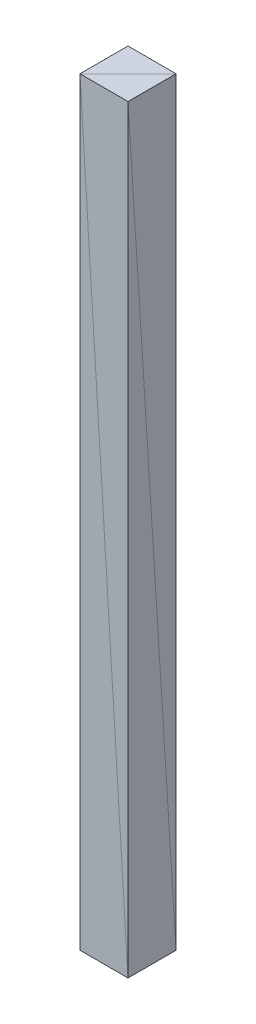
ISO-10303-21;
HEADER;
FILE_DESCRIPTION(('STEP AP214'),'2;1');
FILE_NAME('part.step','',(''),(''),'','','');
FILE_SCHEMA(('AUTOMOTIVE_DESIGN { 1 0 10303 214 1 1 1 1 }'));
ENDSEC;
DATA;
#1=APPLICATION_CONTEXT('core data for automotive mechanical design processes');
#2=APPLICATION_PROTOCOL_DEFINITION('international standard','automotive_design',2000,#1);
#3=PRODUCT_CONTEXT('',#1,'mechanical');
#4=PRODUCT('Part','Part','',(#3));
#5=PRODUCT_RELATED_PRODUCT_CATEGORY('part','',(#4));
#6=PRODUCT_DEFINITION_FORMATION('','',#4);
#7=PRODUCT_DEFINITION_CONTEXT('part definition',#1,'design');
#8=PRODUCT_DEFINITION('design','',#6,#7);
#9=PRODUCT_DEFINITION_SHAPE('','',#8);
#10=(LENGTH_UNIT() NAMED_UNIT(*) SI_UNIT(.MILLI.,.METRE.));
#11=(NAMED_UNIT(*) PLANE_ANGLE_UNIT() SI_UNIT($,.RADIAN.));
#12=(NAMED_UNIT(*) SI_UNIT($,.STERADIAN.) SOLID_ANGLE_UNIT());
#13=UNCERTAINTY_MEASURE_WITH_UNIT(LENGTH_MEASURE(1.E-05),#10,'distance_accuracy_value','');
#14=(GEOMETRIC_REPRESENTATION_CONTEXT(3) GLOBAL_UNCERTAINTY_ASSIGNED_CONTEXT((#13)) GLOBAL_UNIT_ASSIGNED_CONTEXT((#10,
#11,#12)) REPRESENTATION_CONTEXT('',''));
#15=CARTESIAN_POINT('',(0.,0.,0.));
#16=DIRECTION('',(0.,0.,1.));
#17=DIRECTION('',(1.,0.,0.));
#18=AXIS2_PLACEMENT_3D('',#15,#16,#17);
#19=CARTESIAN_POINT('',(0.,0.,0.));
#20=DIRECTION('',(0.,-1.,0.));
#21=DIRECTION('',(0.,0.,-1.));
#22=AXIS2_PLACEMENT_3D('',#19,#20,#21);
#23=PLANE('',#22);
#24=DIRECTION('',(1.,0.,0.));
#25=VECTOR('',#24,1.);
#26=CARTESIAN_POINT('',(0.,0.,9.4999996945262));
#27=LINE('',#26,#25);
#28=CARTESIAN_POINT('',(0.,0.,9.4999996945262));
#29=VERTEX_POINT('',#28);
#30=CARTESIAN_POINT('',(9.4999996945262,0.,9.4999996945262));
#31=VERTEX_POINT('',#30);
#32=EDGE_CURVE('E19',#29,#31,#27,.T.);
#33=ORIENTED_EDGE('',*,*,#32,.F.);
#34=DIRECTION('',(0.,0.,1.));
#35=VECTOR('',#34,1.);
#36=CARTESIAN_POINT('',(0.,0.,0.));
#37=LINE('',#36,#35);
#38=CARTESIAN_POINT('',(0.,0.,0.));
#39=VERTEX_POINT('',#38);
#40=EDGE_CURVE('E59',#39,#29,#37,.T.);
#41=ORIENTED_EDGE('',*,*,#40,.F.);
#42=DIRECTION('',(-0.707106781186548,0.,-0.707106781186548));
#43=VECTOR('',#42,1.);
#44=CARTESIAN_POINT('',(9.4999996945262,0.,9.4999996945262));
#45=LINE('',#44,#43);
#46=EDGE_CURVE('E75',#31,#39,#45,.T.);
#47=ORIENTED_EDGE('',*,*,#46,.F.);
#48=EDGE_LOOP('',(#33,#41,#47));
#49=FACE_BOUND('',#48,.T.);
#50=ADVANCED_FACE('F16',(#49),#23,.T.);
#51=CARTESIAN_POINT('',(0.,0.,9.4999996945262));
#52=DIRECTION('',(0.,0.,-1.));
#53=DIRECTION('',(-1.,0.,0.));
#54=AXIS2_PLACEMENT_3D('',#51,#52,#53);
#55=PLANE('',#54);
#56=ORIENTED_EDGE('',*,*,#32,.T.);
#57=DIRECTION('',(0.0632066911301987,-0.998000458014109,0.));
#58=VECTOR('',#57,1.);
#59=CARTESIAN_POINT('',(0.,150.000005960464,9.4999996945262));
#60=LINE('',#59,#58);
#61=CARTESIAN_POINT('',(0.,150.000005960464,9.4999996945262));
#62=VERTEX_POINT('',#61);
#63=EDGE_CURVE('E86',#62,#31,#60,.T.);
#64=ORIENTED_EDGE('',*,*,#63,.F.);
#65=DIRECTION('',(0.,1.,0.));
#66=VECTOR('',#65,1.);
#67=CARTESIAN_POINT('',(0.,0.,9.4999996945262));
#68=LINE('',#67,#66);
#69=EDGE_CURVE('E72',#29,#62,#68,.T.);
#70=ORIENTED_EDGE('',*,*,#69,.F.);
#71=EDGE_LOOP('',(#56,#64,#70));
#72=FACE_BOUND('',#71,.T.);
#73=ADVANCED_FACE('F149',(#72),#55,.F.);
#74=CARTESIAN_POINT('',(0.,0.,0.));
#75=DIRECTION('',(1.,0.,0.));
#76=DIRECTION('',(0.,0.,-1.));
#77=AXIS2_PLACEMENT_3D('',#74,#75,#76);
#78=PLANE('',#77);
#79=ORIENTED_EDGE('',*,*,#40,.T.);
#80=DIRECTION('',(0.,-0.998000458014109,0.0632066911301987));
#81=VECTOR('',#80,1.);
#82=CARTESIAN_POINT('',(0.,150.000005960464,0.));
#83=LINE('',#82,#81);
#84=CARTESIAN_POINT('',(0.,150.000005960464,0.));
#85=VERTEX_POINT('',#84);
#86=EDGE_CURVE('E58',#85,#29,#83,.T.);
#87=ORIENTED_EDGE('',*,*,#86,.F.);
#88=DIRECTION('',(0.,1.,0.));
#89=VECTOR('',#88,1.);
#90=CARTESIAN_POINT('',(0.,0.,0.));
#91=LINE('',#90,#89);
#92=EDGE_CURVE('E54',#39,#85,#91,.T.);
#93=ORIENTED_EDGE('',*,*,#92,.F.);
#94=EDGE_LOOP('',(#79,#87,#93));
#95=FACE_BOUND('',#94,.T.);
#96=ADVANCED_FACE('F60',(#95),#78,.F.);
#97=CARTESIAN_POINT('',(0.,0.,0.));
#98=DIRECTION('',(-1.,0.,0.));
#99=DIRECTION('',(0.,0.,1.));
#100=AXIS2_PLACEMENT_3D('',#97,#98,#99);
#101=PLANE('',#100);
#102=ORIENTED_EDGE('',*,*,#69,.T.);
#103=DIRECTION('',(0.,0.,1.));
#104=VECTOR('',#103,1.);
#105=CARTESIAN_POINT('',(0.,150.000005960464,0.));
#106=LINE('',#105,#104);
#107=EDGE_CURVE('E81',#85,#62,#106,.T.);
#108=ORIENTED_EDGE('',*,*,#107,.F.);
#109=ORIENTED_EDGE('',*,*,#86,.T.);
#110=EDGE_LOOP('',(#102,#108,#109));
#111=FACE_BOUND('',#110,.T.);
#112=ADVANCED_FACE('F97',(#111),#101,.T.);
#113=CARTESIAN_POINT('',(0.,0.,0.));
#114=DIRECTION('',(0.,1.,0.));
#115=DIRECTION('',(0.,0.,1.));
#116=AXIS2_PLACEMENT_3D('',#113,#114,#115);
#117=PLANE('',#116);
#118=DIRECTION('',(0.,0.,-1.));
#119=VECTOR('',#118,1.);
#120=CARTESIAN_POINT('',(9.4999996945262,0.,9.4999996945262));
#121=LINE('',#120,#119);
#122=CARTESIAN_POINT('',(9.4999996945262,0.,0.));
#123=VERTEX_POINT('',#122);
#124=EDGE_CURVE('E78',#31,#123,#121,.T.);
#125=ORIENTED_EDGE('',*,*,#124,.F.);
#126=ORIENTED_EDGE('',*,*,#46,.T.);
#127=DIRECTION('',(-1.,0.,0.));
#128=VECTOR('',#127,1.);
#129=CARTESIAN_POINT('',(9.4999996945262,0.,0.));
#130=LINE('',#129,#128);
#131=EDGE_CURVE('E66',#123,#39,#130,.T.);
#132=ORIENTED_EDGE('',*,*,#131,.F.);
#133=EDGE_LOOP('',(#125,#126,#132));
#134=FACE_BOUND('',#133,.T.);
#135=ADVANCED_FACE('F80',(#134),#117,.F.);
#136=CARTESIAN_POINT('',(0.,150.000005960464,0.));
#137=DIRECTION('',(0.,1.,0.));
#138=DIRECTION('',(0.,0.,1.));
#139=AXIS2_PLACEMENT_3D('',#136,#137,#138);
#140=PLANE('',#139);
#141=DIRECTION('',(1.,0.,0.));
#142=VECTOR('',#141,1.);
#143=CARTESIAN_POINT('',(0.,150.000005960464,0.));
#144=LINE('',#143,#142);
#145=CARTESIAN_POINT('',(9.4999996945262,150.000005960464,0.));
#146=VERTEX_POINT('',#145);
#147=EDGE_CURVE('E65',#85,#146,#144,.T.);
#148=ORIENTED_EDGE('',*,*,#147,.F.);
#149=ORIENTED_EDGE('',*,*,#107,.T.);
#150=DIRECTION('',(-0.707106781186548,0.,0.707106781186548));
#151=VECTOR('',#150,1.);
#152=CARTESIAN_POINT('',(9.4999996945262,150.000005960464,0.));
#153=LINE('',#152,#151);
#154=EDGE_CURVE('E106',#146,#62,#153,.T.);
#155=ORIENTED_EDGE('',*,*,#154,.F.);
#156=EDGE_LOOP('',(#148,#149,#155));
#157=FACE_BOUND('',#156,.T.);
#158=ADVANCED_FACE('F102',(#157),#140,.T.);
#159=CARTESIAN_POINT('',(0.,0.,0.));
#160=DIRECTION('',(0.,0.,1.));
#161=DIRECTION('',(1.,0.,0.));
#162=AXIS2_PLACEMENT_3D('',#159,#160,#161);
#163=PLANE('',#162);
#164=ORIENTED_EDGE('',*,*,#131,.T.);
#165=DIRECTION('',(-0.0632066911301987,-0.998000458014109,0.));
#166=VECTOR('',#165,1.);
#167=CARTESIAN_POINT('',(9.4999996945262,150.000005960464,0.));
#168=LINE('',#167,#166);
#169=EDGE_CURVE('E82',#146,#39,#168,.T.);
#170=ORIENTED_EDGE('',*,*,#169,.F.);
#171=DIRECTION('',(0.,1.,0.));
#172=VECTOR('',#171,1.);
#173=CARTESIAN_POINT('',(9.4999996945262,0.,0.));
#174=LINE('',#173,#172);
#175=EDGE_CURVE('E35',#123,#146,#174,.T.);
#176=ORIENTED_EDGE('',*,*,#175,.F.);
#177=EDGE_LOOP('',(#164,#170,#176));
#178=FACE_BOUND('',#177,.T.);
#179=ADVANCED_FACE('F83',(#178),#163,.F.);
#180=CARTESIAN_POINT('',(0.,0.,0.));
#181=DIRECTION('',(0.,0.,-1.));
#182=DIRECTION('',(-1.,0.,0.));
#183=AXIS2_PLACEMENT_3D('',#180,#181,#182);
#184=PLANE('',#183);
#185=ORIENTED_EDGE('',*,*,#92,.T.);
#186=ORIENTED_EDGE('',*,*,#147,.T.);
#187=ORIENTED_EDGE('',*,*,#169,.T.);
#188=EDGE_LOOP('',(#185,#186,#187));
#189=FACE_BOUND('',#188,.T.);
#190=ADVANCED_FACE('F87',(#189),#184,.T.);
#191=CARTESIAN_POINT('',(0.,0.,9.4999996945262));
#192=DIRECTION('',(0.,0.,1.));
#193=DIRECTION('',(1.,0.,0.));
#194=AXIS2_PLACEMENT_3D('',#191,#192,#193);
#195=PLANE('',#194);
#196=DIRECTION('',(0.,-1.,0.));
#197=VECTOR('',#196,1.);
#198=CARTESIAN_POINT('',(9.4999996945262,150.000005960464,9.4999996945262));
#199=LINE('',#198,#197);
#200=CARTESIAN_POINT('',(9.4999996945262,150.000005960464,9.4999996945262));
#201=VERTEX_POINT('',#200);
#202=EDGE_CURVE('E112',#201,#31,#199,.T.);
#203=ORIENTED_EDGE('',*,*,#202,.F.);
#204=DIRECTION('',(1.,0.,0.));
#205=VECTOR('',#204,1.);
#206=CARTESIAN_POINT('',(0.,150.000005960464,9.4999996945262));
#207=LINE('',#206,#205);
#208=EDGE_CURVE('E89',#62,#201,#207,.T.);
#209=ORIENTED_EDGE('',*,*,#208,.F.);
#210=ORIENTED_EDGE('',*,*,#63,.T.);
#211=EDGE_LOOP('',(#203,#209,#210));
#212=FACE_BOUND('',#211,.T.);
#213=ADVANCED_FACE('F108',(#212),#195,.T.);
#214=CARTESIAN_POINT('',(0.,150.000005960464,0.));
#215=DIRECTION('',(0.,-1.,0.));
#216=DIRECTION('',(0.,0.,-1.));
#217=AXIS2_PLACEMENT_3D('',#214,#215,#216);
#218=PLANE('',#217);
#219=DIRECTION('',(0.,0.,1.));
#220=VECTOR('',#219,1.);
#221=CARTESIAN_POINT('',(9.4999996945262,150.000005960464,0.));
#222=LINE('',#221,#220);
#223=EDGE_CURVE('E25',#146,#201,#222,.T.);
#224=ORIENTED_EDGE('',*,*,#223,.F.);
#225=ORIENTED_EDGE('',*,*,#154,.T.);
#226=ORIENTED_EDGE('',*,*,#208,.T.);
#227=EDGE_LOOP('',(#224,#225,#226));
#228=FACE_BOUND('',#227,.T.);
#229=ADVANCED_FACE('F113',(#228),#218,.F.);
#230=CARTESIAN_POINT('',(9.4999996945262,0.,0.));
#231=DIRECTION('',(-1.,0.,0.));
#232=DIRECTION('',(0.,0.,1.));
#233=AXIS2_PLACEMENT_3D('',#230,#231,#232);
#234=PLANE('',#233);
#235=ORIENTED_EDGE('',*,*,#124,.T.);
#236=DIRECTION('',(0.,-0.998000458014109,-0.0632066911301987));
#237=VECTOR('',#236,1.);
#238=CARTESIAN_POINT('',(9.4999996945262,150.000005960464,9.4999996945262));
#239=LINE('',#238,#237);
#240=EDGE_CURVE('E10',#201,#123,#239,.T.);
#241=ORIENTED_EDGE('',*,*,#240,.F.);
#242=ORIENTED_EDGE('',*,*,#202,.T.);
#243=EDGE_LOOP('',(#235,#241,#242));
#244=FACE_BOUND('',#243,.T.);
#245=ADVANCED_FACE('F124',(#244),#234,.F.);
#246=CARTESIAN_POINT('',(9.4999996945262,0.,0.));
#247=DIRECTION('',(1.,0.,0.));
#248=DIRECTION('',(0.,0.,-1.));
#249=AXIS2_PLACEMENT_3D('',#246,#247,#248);
#250=PLANE('',#249);
#251=ORIENTED_EDGE('',*,*,#175,.T.);
#252=ORIENTED_EDGE('',*,*,#223,.T.);
#253=ORIENTED_EDGE('',*,*,#240,.T.);
#254=EDGE_LOOP('',(#251,#252,#253));
#255=FACE_BOUND('',#254,.T.);
#256=ADVANCED_FACE('F123',(#255),#250,.T.);
#257=CLOSED_SHELL('',(#50,#73,#96,#112,#135,#158,#179,#190,#213,#229,#245,#256));
#258=MANIFOLD_SOLID_BREP('B1',#257);
#259=ADVANCED_BREP_SHAPE_REPRESENTATION('',(#18,#258),#14);
#260=SHAPE_DEFINITION_REPRESENTATION(#9,#259);
ENDSEC;
END-ISO-10303-21;
